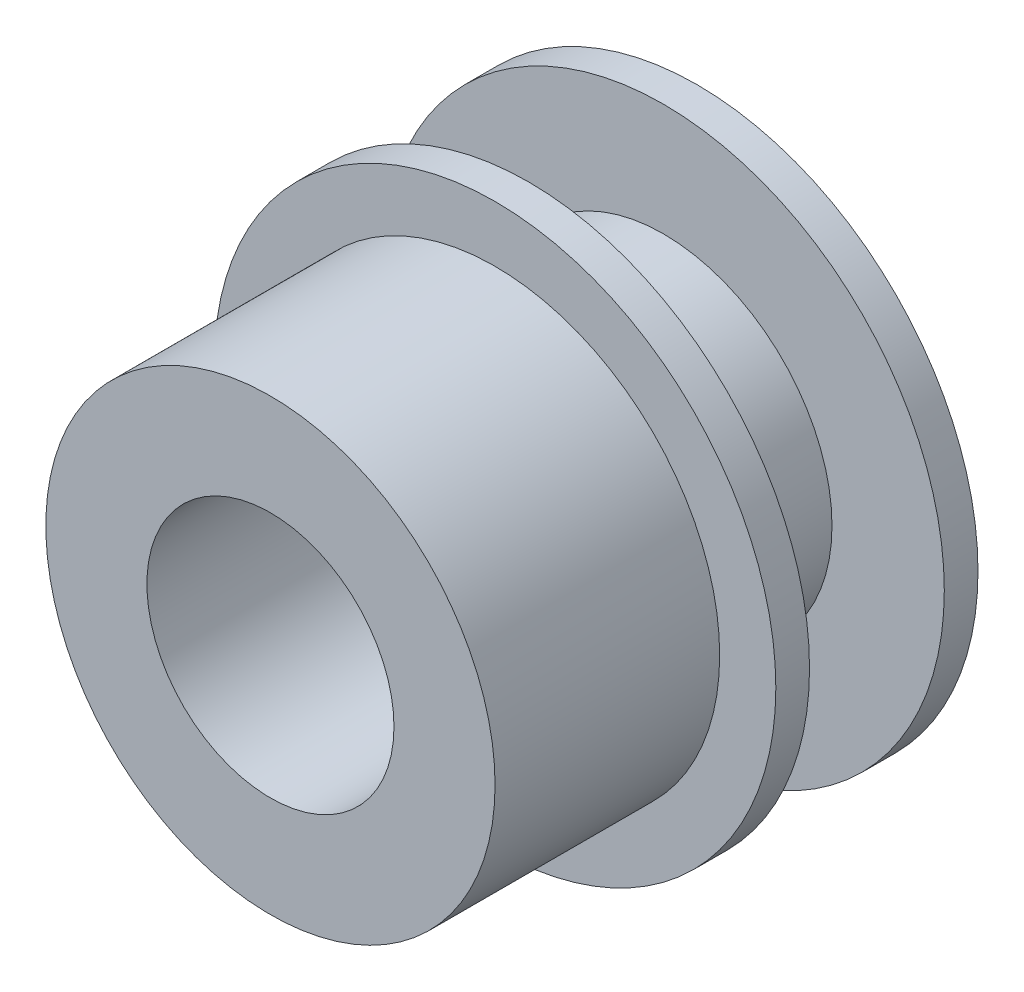
ISO-10303-21;
HEADER;
FILE_DESCRIPTION(('STEP AP214'),'2;1');
FILE_NAME('part.step','',(''),(''),'','','');
FILE_SCHEMA(('AUTOMOTIVE_DESIGN { 1 0 10303 214 1 1 1 1 }'));
ENDSEC;
DATA;
#1=APPLICATION_CONTEXT('core data for automotive mechanical design processes');
#2=APPLICATION_PROTOCOL_DEFINITION('international standard','automotive_design',2000,#1);
#3=PRODUCT_CONTEXT('',#1,'mechanical');
#4=PRODUCT('Part','Part','',(#3));
#5=PRODUCT_RELATED_PRODUCT_CATEGORY('part','',(#4));
#6=PRODUCT_DEFINITION_FORMATION('','',#4);
#7=PRODUCT_DEFINITION_CONTEXT('part definition',#1,'design');
#8=PRODUCT_DEFINITION('design','',#6,#7);
#9=PRODUCT_DEFINITION_SHAPE('','',#8);
#10=(LENGTH_UNIT() NAMED_UNIT(*) SI_UNIT(.MILLI.,.METRE.));
#11=(NAMED_UNIT(*) PLANE_ANGLE_UNIT() SI_UNIT($,.RADIAN.));
#12=(NAMED_UNIT(*) SI_UNIT($,.STERADIAN.) SOLID_ANGLE_UNIT());
#13=UNCERTAINTY_MEASURE_WITH_UNIT(LENGTH_MEASURE(1.E-05),#10,'distance_accuracy_value','');
#14=(GEOMETRIC_REPRESENTATION_CONTEXT(3) GLOBAL_UNCERTAINTY_ASSIGNED_CONTEXT((#13)) GLOBAL_UNIT_ASSIGNED_CONTEXT((#10,
#11,#12)) REPRESENTATION_CONTEXT('',''));
#15=CARTESIAN_POINT('',(0.,0.,0.));
#16=DIRECTION('',(0.,0.,1.));
#17=DIRECTION('',(1.,0.,0.));
#18=AXIS2_PLACEMENT_3D('',#15,#16,#17);
#19=CARTESIAN_POINT('',(0.,0.,3.));
#20=DIRECTION('',(0.,0.,-1.));
#21=DIRECTION('',(-1.,0.,0.));
#22=AXIS2_PLACEMENT_3D('',#19,#20,#21);
#23=CYLINDRICAL_SURFACE('',#22,25.);
#24=CARTESIAN_POINT('',(0.,0.,3.));
#25=DIRECTION('',(0.,0.,1.));
#26=DIRECTION('',(1.,0.,0.));
#27=AXIS2_PLACEMENT_3D('',#24,#25,#26);
#28=CIRCLE('',#27,25.);
#29=CARTESIAN_POINT('',(25.,0.,3.));
#30=VERTEX_POINT('',#29);
#31=EDGE_CURVE('E10',#30,#30,#28,.T.);
#32=ORIENTED_EDGE('',*,*,#31,.F.);
#33=EDGE_LOOP('',(#32));
#34=FACE_BOUND('',#33,.T.);
#35=CARTESIAN_POINT('',(0.,0.,0.));
#36=DIRECTION('',(0.,0.,1.));
#37=DIRECTION('',(1.,0.,0.));
#38=AXIS2_PLACEMENT_3D('',#35,#36,#37);
#39=CIRCLE('',#38,25.);
#40=CARTESIAN_POINT('',(25.,0.,0.));
#41=VERTEX_POINT('',#40);
#42=EDGE_CURVE('E34',#41,#41,#39,.T.);
#43=ORIENTED_EDGE('',*,*,#42,.T.);
#44=EDGE_LOOP('',(#43));
#45=FACE_BOUND('',#44,.T.);
#46=ADVANCED_FACE('F31',(#34,#45),#23,.T.);
#47=CARTESIAN_POINT('',(0.,0.,3.));
#48=DIRECTION('',(0.,0.,1.));
#49=DIRECTION('',(1.,0.,0.));
#50=AXIS2_PLACEMENT_3D('',#47,#48,#49);
#51=PLANE('',#50);
#52=CARTESIAN_POINT('',(0.,0.,3.));
#53=DIRECTION('',(0.,0.,1.));
#54=DIRECTION('',(1.,0.,0.));
#55=AXIS2_PLACEMENT_3D('',#52,#53,#54);
#56=CIRCLE('',#55,15.);
#57=CARTESIAN_POINT('',(15.,0.,3.));
#58=VERTEX_POINT('',#57);
#59=EDGE_CURVE('E41',#58,#58,#56,.F.);
#60=ORIENTED_EDGE('',*,*,#59,.T.);
#61=EDGE_LOOP('',(#60));
#62=FACE_BOUND('',#61,.T.);
#63=ORIENTED_EDGE('',*,*,#31,.T.);
#64=EDGE_LOOP('',(#63));
#65=FACE_BOUND('',#64,.T.);
#66=ADVANCED_FACE('F102',(#62,#65),#51,.T.);
#67=CARTESIAN_POINT('',(0.,0.,0.));
#68=DIRECTION('',(0.,0.,1.));
#69=DIRECTION('',(1.,0.,0.));
#70=AXIS2_PLACEMENT_3D('',#67,#68,#69);
#71=PLANE('',#70);
#72=CARTESIAN_POINT('',(0.,0.,0.));
#73=DIRECTION('',(0.,0.,1.));
#74=DIRECTION('',(1.,0.,0.));
#75=AXIS2_PLACEMENT_3D('',#72,#73,#74);
#76=CIRCLE('',#75,11.);
#77=CARTESIAN_POINT('',(11.,0.,0.));
#78=VERTEX_POINT('',#77);
#79=EDGE_CURVE('E58',#78,#78,#76,.T.);
#80=ORIENTED_EDGE('',*,*,#79,.T.);
#81=EDGE_LOOP('',(#80));
#82=FACE_BOUND('',#81,.T.);
#83=ORIENTED_EDGE('',*,*,#42,.F.);
#84=EDGE_LOOP('',(#83));
#85=FACE_BOUND('',#84,.T.);
#86=ADVANCED_FACE('F107',(#82,#85),#71,.F.);
#87=CARTESIAN_POINT('',(0.,0.,15.));
#88=DIRECTION('',(0.,0.,-1.));
#89=DIRECTION('',(-1.,0.,0.));
#90=AXIS2_PLACEMENT_3D('',#87,#88,#89);
#91=CYLINDRICAL_SURFACE('',#90,15.);
#92=ORIENTED_EDGE('',*,*,#59,.F.);
#93=EDGE_LOOP('',(#92));
#94=FACE_BOUND('',#93,.T.);
#95=CARTESIAN_POINT('',(0.,0.,15.));
#96=DIRECTION('',(0.,0.,1.));
#97=DIRECTION('',(1.,0.,0.));
#98=AXIS2_PLACEMENT_3D('',#95,#96,#97);
#99=CIRCLE('',#98,15.);
#100=CARTESIAN_POINT('',(15.,0.,15.));
#101=VERTEX_POINT('',#100);
#102=EDGE_CURVE('E45',#101,#101,#99,.T.);
#103=ORIENTED_EDGE('',*,*,#102,.F.);
#104=EDGE_LOOP('',(#103));
#105=FACE_BOUND('',#104,.T.);
#106=ADVANCED_FACE('F92',(#94,#105),#91,.T.);
#107=CARTESIAN_POINT('',(0.,0.,18.));
#108=DIRECTION('',(0.,0.,-1.));
#109=DIRECTION('',(-1.,0.,0.));
#110=AXIS2_PLACEMENT_3D('',#107,#108,#109);
#111=CYLINDRICAL_SURFACE('',#110,25.);
#112=CARTESIAN_POINT('',(0.,0.,18.));
#113=DIRECTION('',(0.,0.,1.));
#114=DIRECTION('',(1.,0.,0.));
#115=AXIS2_PLACEMENT_3D('',#112,#113,#114);
#116=CIRCLE('',#115,25.);
#117=CARTESIAN_POINT('',(25.,0.,18.));
#118=VERTEX_POINT('',#117);
#119=EDGE_CURVE('E48',#118,#118,#116,.T.);
#120=ORIENTED_EDGE('',*,*,#119,.F.);
#121=EDGE_LOOP('',(#120));
#122=FACE_BOUND('',#121,.T.);
#123=CARTESIAN_POINT('',(0.,0.,15.));
#124=DIRECTION('',(0.,0.,1.));
#125=DIRECTION('',(1.,0.,0.));
#126=AXIS2_PLACEMENT_3D('',#123,#124,#125);
#127=CIRCLE('',#126,25.);
#128=CARTESIAN_POINT('',(25.,0.,15.));
#129=VERTEX_POINT('',#128);
#130=EDGE_CURVE('E49',#129,#129,#127,.T.);
#131=ORIENTED_EDGE('',*,*,#130,.T.);
#132=EDGE_LOOP('',(#131));
#133=FACE_BOUND('',#132,.T.);
#134=ADVANCED_FACE('F86',(#122,#133),#111,.T.);
#135=CARTESIAN_POINT('',(0.,0.,18.));
#136=DIRECTION('',(0.,0.,1.));
#137=DIRECTION('',(1.,0.,0.));
#138=AXIS2_PLACEMENT_3D('',#135,#136,#137);
#139=PLANE('',#138);
#140=CARTESIAN_POINT('',(0.,0.,18.));
#141=DIRECTION('',(0.,0.,1.));
#142=DIRECTION('',(1.,0.,0.));
#143=AXIS2_PLACEMENT_3D('',#140,#141,#142);
#144=CIRCLE('',#143,20.);
#145=CARTESIAN_POINT('',(20.,0.,18.));
#146=VERTEX_POINT('',#145);
#147=EDGE_CURVE('E55',#146,#146,#144,.T.);
#148=ORIENTED_EDGE('',*,*,#147,.F.);
#149=EDGE_LOOP('',(#148));
#150=FACE_BOUND('',#149,.T.);
#151=ORIENTED_EDGE('',*,*,#119,.T.);
#152=EDGE_LOOP('',(#151));
#153=FACE_BOUND('',#152,.T.);
#154=ADVANCED_FACE('F83',(#150,#153),#139,.T.);
#155=CARTESIAN_POINT('',(0.,0.,15.));
#156=DIRECTION('',(0.,0.,1.));
#157=DIRECTION('',(1.,0.,0.));
#158=AXIS2_PLACEMENT_3D('',#155,#156,#157);
#159=PLANE('',#158);
#160=ORIENTED_EDGE('',*,*,#102,.T.);
#161=EDGE_LOOP('',(#160));
#162=FACE_BOUND('',#161,.T.);
#163=ORIENTED_EDGE('',*,*,#130,.F.);
#164=EDGE_LOOP('',(#163));
#165=FACE_BOUND('',#164,.T.);
#166=ADVANCED_FACE('F79',(#162,#165),#159,.F.);
#167=CARTESIAN_POINT('',(0.,0.,38.));
#168=DIRECTION('',(0.,0.,-1.));
#169=DIRECTION('',(-1.,0.,0.));
#170=AXIS2_PLACEMENT_3D('',#167,#168,#169);
#171=CYLINDRICAL_SURFACE('',#170,20.);
#172=CARTESIAN_POINT('',(0.,0.,38.));
#173=DIRECTION('',(0.,0.,1.));
#174=DIRECTION('',(1.,0.,0.));
#175=AXIS2_PLACEMENT_3D('',#172,#173,#174);
#176=CIRCLE('',#175,20.);
#177=CARTESIAN_POINT('',(20.,0.,38.));
#178=VERTEX_POINT('',#177);
#179=EDGE_CURVE('E52',#178,#178,#176,.T.);
#180=ORIENTED_EDGE('',*,*,#179,.F.);
#181=EDGE_LOOP('',(#180));
#182=FACE_BOUND('',#181,.T.);
#183=ORIENTED_EDGE('',*,*,#147,.T.);
#184=EDGE_LOOP('',(#183));
#185=FACE_BOUND('',#184,.T.);
#186=ADVANCED_FACE('F73',(#182,#185),#171,.T.);
#187=CARTESIAN_POINT('',(0.,0.,38.));
#188=DIRECTION('',(0.,0.,1.));
#189=DIRECTION('',(1.,0.,0.));
#190=AXIS2_PLACEMENT_3D('',#187,#188,#189);
#191=PLANE('',#190);
#192=CARTESIAN_POINT('',(0.,0.,38.));
#193=DIRECTION('',(0.,0.,1.));
#194=DIRECTION('',(1.,0.,0.));
#195=AXIS2_PLACEMENT_3D('',#192,#193,#194);
#196=CIRCLE('',#195,11.);
#197=CARTESIAN_POINT('',(11.,0.,38.));
#198=VERTEX_POINT('',#197);
#199=EDGE_CURVE('E63',#198,#198,#196,.T.);
#200=ORIENTED_EDGE('',*,*,#199,.F.);
#201=EDGE_LOOP('',(#200));
#202=FACE_BOUND('',#201,.T.);
#203=ORIENTED_EDGE('',*,*,#179,.T.);
#204=EDGE_LOOP('',(#203));
#205=FACE_BOUND('',#204,.T.);
#206=ADVANCED_FACE('F70',(#202,#205),#191,.T.);
#207=CARTESIAN_POINT('',(0.,0.,-12.));
#208=DIRECTION('',(0.,0.,1.));
#209=DIRECTION('',(1.,0.,0.));
#210=AXIS2_PLACEMENT_3D('',#207,#208,#209);
#211=CYLINDRICAL_SURFACE('',#210,11.);
#212=ORIENTED_EDGE('',*,*,#199,.T.);
#213=EDGE_LOOP('',(#212));
#214=FACE_BOUND('',#213,.T.);
#215=ORIENTED_EDGE('',*,*,#79,.F.);
#216=EDGE_LOOP('',(#215));
#217=FACE_BOUND('',#216,.T.);
#218=ADVANCED_FACE('F67',(#214,#217),#211,.F.);
#219=CLOSED_SHELL('',(#46,#66,#86,#106,#134,#154,#166,#186,#206,#218));
#220=MANIFOLD_SOLID_BREP('B2',#219);
#221=ADVANCED_BREP_SHAPE_REPRESENTATION('',(#18,#220),#14);
#222=SHAPE_DEFINITION_REPRESENTATION(#9,#221);
ENDSEC;
END-ISO-10303-21;
